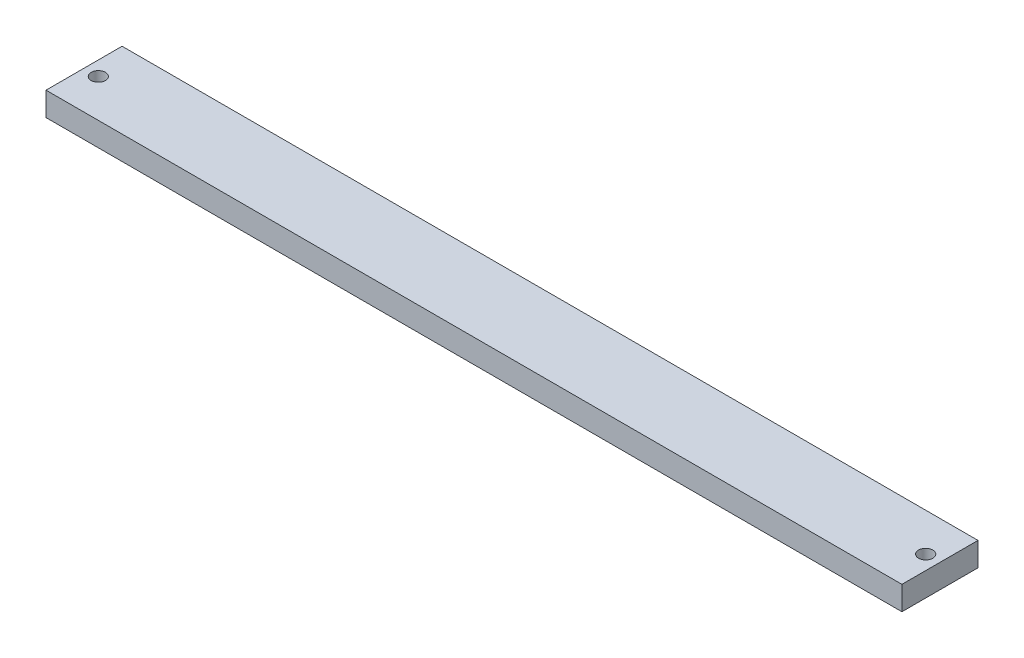
ISO-10303-21;
HEADER;
FILE_DESCRIPTION(('STEP AP214'),'2;1');
FILE_NAME('part.step','',(''),(''),'','','');
FILE_SCHEMA(('AUTOMOTIVE_DESIGN { 1 0 10303 214 1 1 1 1 }'));
ENDSEC;
DATA;
#1=APPLICATION_CONTEXT('core data for automotive mechanical design processes');
#2=APPLICATION_PROTOCOL_DEFINITION('international standard','automotive_design',2000,#1);
#3=PRODUCT_CONTEXT('',#1,'mechanical');
#4=PRODUCT('Part','Part','',(#3));
#5=PRODUCT_RELATED_PRODUCT_CATEGORY('part','',(#4));
#6=PRODUCT_DEFINITION_FORMATION('','',#4);
#7=PRODUCT_DEFINITION_CONTEXT('part definition',#1,'design');
#8=PRODUCT_DEFINITION('design','',#6,#7);
#9=PRODUCT_DEFINITION_SHAPE('','',#8);
#10=(LENGTH_UNIT() NAMED_UNIT(*) SI_UNIT(.MILLI.,.METRE.));
#11=(NAMED_UNIT(*) PLANE_ANGLE_UNIT() SI_UNIT($,.RADIAN.));
#12=(NAMED_UNIT(*) SI_UNIT($,.STERADIAN.) SOLID_ANGLE_UNIT());
#13=UNCERTAINTY_MEASURE_WITH_UNIT(LENGTH_MEASURE(1.E-05),#10,'distance_accuracy_value','');
#14=(GEOMETRIC_REPRESENTATION_CONTEXT(3) GLOBAL_UNCERTAINTY_ASSIGNED_CONTEXT((#13)) GLOBAL_UNIT_ASSIGNED_CONTEXT((#10,
#11,#12)) REPRESENTATION_CONTEXT('',''));
#15=CARTESIAN_POINT('',(0.,0.,0.));
#16=DIRECTION('',(0.,0.,1.));
#17=DIRECTION('',(1.,0.,0.));
#18=AXIS2_PLACEMENT_3D('',#15,#16,#17);
#19=CARTESIAN_POINT('',(-90.,5.,8.00000000000001));
#20=DIRECTION('',(1.,0.,0.));
#21=DIRECTION('',(0.,0.,-1.));
#22=AXIS2_PLACEMENT_3D('',#19,#20,#21);
#23=PLANE('',#22);
#24=DIRECTION('',(0.,0.,1.));
#25=VECTOR('',#24,1.);
#26=CARTESIAN_POINT('',(-90.,0.,8.00000000000001));
#27=LINE('',#26,#25);
#28=CARTESIAN_POINT('',(-90.,0.,-7.99999999999999));
#29=VERTEX_POINT('',#28);
#30=CARTESIAN_POINT('',(-90.,0.,8.00000000000001));
#31=VERTEX_POINT('',#30);
#32=EDGE_CURVE('E103',#29,#31,#27,.T.);
#33=ORIENTED_EDGE('',*,*,#32,.T.);
#34=DIRECTION('',(0.,-1.,0.));
#35=VECTOR('',#34,1.);
#36=CARTESIAN_POINT('',(-90.,5.,8.00000000000001));
#37=LINE('',#36,#35);
#38=CARTESIAN_POINT('',(-90.,5.,8.00000000000001));
#39=VERTEX_POINT('',#38);
#40=EDGE_CURVE('E11',#39,#31,#37,.T.);
#41=ORIENTED_EDGE('',*,*,#40,.F.);
#42=DIRECTION('',(0.,0.,1.));
#43=VECTOR('',#42,1.);
#44=CARTESIAN_POINT('',(-90.,5.,8.00000000000001));
#45=LINE('',#44,#43);
#46=CARTESIAN_POINT('',(-90.,5.,-7.99999999999999));
#47=VERTEX_POINT('',#46);
#48=EDGE_CURVE('E91',#47,#39,#45,.T.);
#49=ORIENTED_EDGE('',*,*,#48,.F.);
#50=DIRECTION('',(0.,-1.,0.));
#51=VECTOR('',#50,1.);
#52=CARTESIAN_POINT('',(-90.,5.,-7.99999999999999));
#53=LINE('',#52,#51);
#54=EDGE_CURVE('E99',#47,#29,#53,.T.);
#55=ORIENTED_EDGE('',*,*,#54,.T.);
#56=EDGE_LOOP('',(#33,#41,#49,#55));
#57=FACE_BOUND('',#56,.T.);
#58=ADVANCED_FACE('F40',(#57),#23,.F.);
#59=CARTESIAN_POINT('',(90.,5.,7.99999999999999));
#60=DIRECTION('',(0.,0.,-1.));
#61=DIRECTION('',(-1.,0.,0.));
#62=AXIS2_PLACEMENT_3D('',#59,#60,#61);
#63=PLANE('',#62);
#64=DIRECTION('',(1.,0.,0.));
#65=VECTOR('',#64,1.);
#66=CARTESIAN_POINT('',(90.,0.,7.99999999999999));
#67=LINE('',#66,#65);
#68=CARTESIAN_POINT('',(90.,0.,7.99999999999999));
#69=VERTEX_POINT('',#68);
#70=EDGE_CURVE('E95',#31,#69,#67,.T.);
#71=ORIENTED_EDGE('',*,*,#70,.T.);
#72=DIRECTION('',(0.,-1.,0.));
#73=VECTOR('',#72,1.);
#74=CARTESIAN_POINT('',(90.,5.,7.99999999999999));
#75=LINE('',#74,#73);
#76=CARTESIAN_POINT('',(90.,5.,7.99999999999999));
#77=VERTEX_POINT('',#76);
#78=EDGE_CURVE('E48',#77,#69,#75,.T.);
#79=ORIENTED_EDGE('',*,*,#78,.F.);
#80=DIRECTION('',(1.,0.,0.));
#81=VECTOR('',#80,1.);
#82=CARTESIAN_POINT('',(90.,5.,7.99999999999999));
#83=LINE('',#82,#81);
#84=EDGE_CURVE('E86',#39,#77,#83,.T.);
#85=ORIENTED_EDGE('',*,*,#84,.F.);
#86=ORIENTED_EDGE('',*,*,#40,.T.);
#87=EDGE_LOOP('',(#71,#79,#85,#86));
#88=FACE_BOUND('',#87,.T.);
#89=ADVANCED_FACE('F94',(#88),#63,.F.);
#90=CARTESIAN_POINT('',(90.,5.,7.99999999999999));
#91=DIRECTION('',(-1.,0.,0.));
#92=DIRECTION('',(0.,0.,1.));
#93=AXIS2_PLACEMENT_3D('',#90,#91,#92);
#94=PLANE('',#93);
#95=DIRECTION('',(0.,0.,-1.));
#96=VECTOR('',#95,1.);
#97=CARTESIAN_POINT('',(90.,0.,7.99999999999999));
#98=LINE('',#97,#96);
#99=CARTESIAN_POINT('',(90.,0.,-8.00000000000001));
#100=VERTEX_POINT('',#99);
#101=EDGE_CURVE('E73',#69,#100,#98,.T.);
#102=ORIENTED_EDGE('',*,*,#101,.T.);
#103=DIRECTION('',(0.,-1.,0.));
#104=VECTOR('',#103,1.);
#105=CARTESIAN_POINT('',(90.,5.,-8.00000000000001));
#106=LINE('',#105,#104);
#107=CARTESIAN_POINT('',(90.,5.,-8.00000000000001));
#108=VERTEX_POINT('',#107);
#109=EDGE_CURVE('E96',#108,#100,#106,.T.);
#110=ORIENTED_EDGE('',*,*,#109,.F.);
#111=DIRECTION('',(0.,0.,-1.));
#112=VECTOR('',#111,1.);
#113=CARTESIAN_POINT('',(90.,5.,7.99999999999999));
#114=LINE('',#113,#112);
#115=EDGE_CURVE('E89',#77,#108,#114,.T.);
#116=ORIENTED_EDGE('',*,*,#115,.F.);
#117=ORIENTED_EDGE('',*,*,#78,.T.);
#118=EDGE_LOOP('',(#102,#110,#116,#117));
#119=FACE_BOUND('',#118,.T.);
#120=ADVANCED_FACE('F97',(#119),#94,.F.);
#121=CARTESIAN_POINT('',(90.,5.,-8.00000000000001));
#122=DIRECTION('',(0.,0.,1.));
#123=DIRECTION('',(1.,0.,0.));
#124=AXIS2_PLACEMENT_3D('',#121,#122,#123);
#125=PLANE('',#124);
#126=DIRECTION('',(-1.,0.,0.));
#127=VECTOR('',#126,1.);
#128=CARTESIAN_POINT('',(90.,0.,-8.00000000000001));
#129=LINE('',#128,#127);
#130=EDGE_CURVE('E79',#100,#29,#129,.T.);
#131=ORIENTED_EDGE('',*,*,#130,.T.);
#132=ORIENTED_EDGE('',*,*,#54,.F.);
#133=DIRECTION('',(-1.,0.,0.));
#134=VECTOR('',#133,1.);
#135=CARTESIAN_POINT('',(90.,5.,-8.00000000000001));
#136=LINE('',#135,#134);
#137=EDGE_CURVE('E56',#108,#47,#136,.T.);
#138=ORIENTED_EDGE('',*,*,#137,.F.);
#139=ORIENTED_EDGE('',*,*,#109,.T.);
#140=EDGE_LOOP('',(#131,#132,#138,#139));
#141=FACE_BOUND('',#140,.T.);
#142=ADVANCED_FACE('F111',(#141),#125,.F.);
#143=CARTESIAN_POINT('',(0.,5.,0.));
#144=DIRECTION('',(0.,1.,0.));
#145=DIRECTION('',(0.,0.,1.));
#146=AXIS2_PLACEMENT_3D('',#143,#144,#145);
#147=PLANE('',#146);
#148=CARTESIAN_POINT('',(87.,5.,0.));
#149=DIRECTION('',(0.,1.,0.));
#150=DIRECTION('',(0.,0.,-1.));
#151=AXIS2_PLACEMENT_3D('',#148,#149,#150);
#152=CIRCLE('',#151,1.5);
#153=CARTESIAN_POINT('',(87.,5.,-1.5));
#154=VERTEX_POINT('',#153);
#155=EDGE_CURVE('E120',#154,#154,#152,.T.);
#156=ORIENTED_EDGE('',*,*,#155,.F.);
#157=EDGE_LOOP('',(#156));
#158=FACE_BOUND('',#157,.T.);
#159=CARTESIAN_POINT('',(-87.,5.,0.));
#160=DIRECTION('',(0.,-1.,0.));
#161=DIRECTION('',(0.,0.,-1.));
#162=AXIS2_PLACEMENT_3D('',#159,#160,#161);
#163=CIRCLE('',#162,1.5);
#164=CARTESIAN_POINT('',(-87.,5.,-1.5));
#165=VERTEX_POINT('',#164);
#166=EDGE_CURVE('E106',#165,#165,#163,.T.);
#167=ORIENTED_EDGE('',*,*,#166,.T.);
#168=EDGE_LOOP('',(#167));
#169=FACE_BOUND('',#168,.T.);
#170=ORIENTED_EDGE('',*,*,#48,.T.);
#171=ORIENTED_EDGE('',*,*,#84,.T.);
#172=ORIENTED_EDGE('',*,*,#115,.T.);
#173=ORIENTED_EDGE('',*,*,#137,.T.);
#174=EDGE_LOOP('',(#170,#171,#172,#173));
#175=FACE_BOUND('',#174,.T.);
#176=ADVANCED_FACE('F87',(#158,#169,#175),#147,.T.);
#177=CARTESIAN_POINT('',(0.,0.,0.));
#178=DIRECTION('',(0.,1.,0.));
#179=DIRECTION('',(0.,0.,1.));
#180=AXIS2_PLACEMENT_3D('',#177,#178,#179);
#181=PLANE('',#180);
#182=CARTESIAN_POINT('',(87.,0.,0.));
#183=DIRECTION('',(0.,1.,0.));
#184=DIRECTION('',(0.,0.,-1.));
#185=AXIS2_PLACEMENT_3D('',#182,#183,#184);
#186=CIRCLE('',#185,1.5);
#187=CARTESIAN_POINT('',(87.,0.,-1.5));
#188=VERTEX_POINT('',#187);
#189=EDGE_CURVE('E123',#188,#188,#186,.T.);
#190=ORIENTED_EDGE('',*,*,#189,.T.);
#191=EDGE_LOOP('',(#190));
#192=FACE_BOUND('',#191,.T.);
#193=CARTESIAN_POINT('',(-87.,0.,0.));
#194=DIRECTION('',(0.,-1.,0.));
#195=DIRECTION('',(0.,0.,-1.));
#196=AXIS2_PLACEMENT_3D('',#193,#194,#195);
#197=CIRCLE('',#196,1.5);
#198=CARTESIAN_POINT('',(-87.,0.,-1.5));
#199=VERTEX_POINT('',#198);
#200=EDGE_CURVE('E117',#199,#199,#197,.T.);
#201=ORIENTED_EDGE('',*,*,#200,.F.);
#202=EDGE_LOOP('',(#201));
#203=FACE_BOUND('',#202,.T.);
#204=ORIENTED_EDGE('',*,*,#32,.F.);
#205=ORIENTED_EDGE('',*,*,#130,.F.);
#206=ORIENTED_EDGE('',*,*,#101,.F.);
#207=ORIENTED_EDGE('',*,*,#70,.F.);
#208=EDGE_LOOP('',(#204,#205,#206,#207));
#209=FACE_BOUND('',#208,.T.);
#210=ADVANCED_FACE('F114',(#192,#203,#209),#181,.F.);
#211=CARTESIAN_POINT('',(-87.,5.,0.));
#212=DIRECTION('',(0.,-1.,0.));
#213=DIRECTION('',(0.,0.,-1.));
#214=AXIS2_PLACEMENT_3D('',#211,#212,#213);
#215=CYLINDRICAL_SURFACE('',#214,1.5);
#216=ORIENTED_EDGE('',*,*,#166,.F.);
#217=EDGE_LOOP('',(#216));
#218=FACE_BOUND('',#217,.T.);
#219=ORIENTED_EDGE('',*,*,#200,.T.);
#220=EDGE_LOOP('',(#219));
#221=FACE_BOUND('',#220,.T.);
#222=ADVANCED_FACE('F137',(#218,#221),#215,.F.);
#223=CARTESIAN_POINT('',(87.,5.,0.));
#224=DIRECTION('',(0.,-1.,0.));
#225=DIRECTION('',(0.,0.,-1.));
#226=AXIS2_PLACEMENT_3D('',#223,#224,#225);
#227=CYLINDRICAL_SURFACE('',#226,1.5);
#228=ORIENTED_EDGE('',*,*,#155,.T.);
#229=EDGE_LOOP('',(#228));
#230=FACE_BOUND('',#229,.T.);
#231=ORIENTED_EDGE('',*,*,#189,.F.);
#232=EDGE_LOOP('',(#231));
#233=FACE_BOUND('',#232,.T.);
#234=ADVANCED_FACE('F129',(#230,#233),#227,.F.);
#235=CLOSED_SHELL('',(#58,#89,#120,#142,#176,#210,#222,#234));
#236=MANIFOLD_SOLID_BREP('B2',#235);
#237=ADVANCED_BREP_SHAPE_REPRESENTATION('',(#18,#236),#14);
#238=SHAPE_DEFINITION_REPRESENTATION(#9,#237);
ENDSEC;
END-ISO-10303-21;
